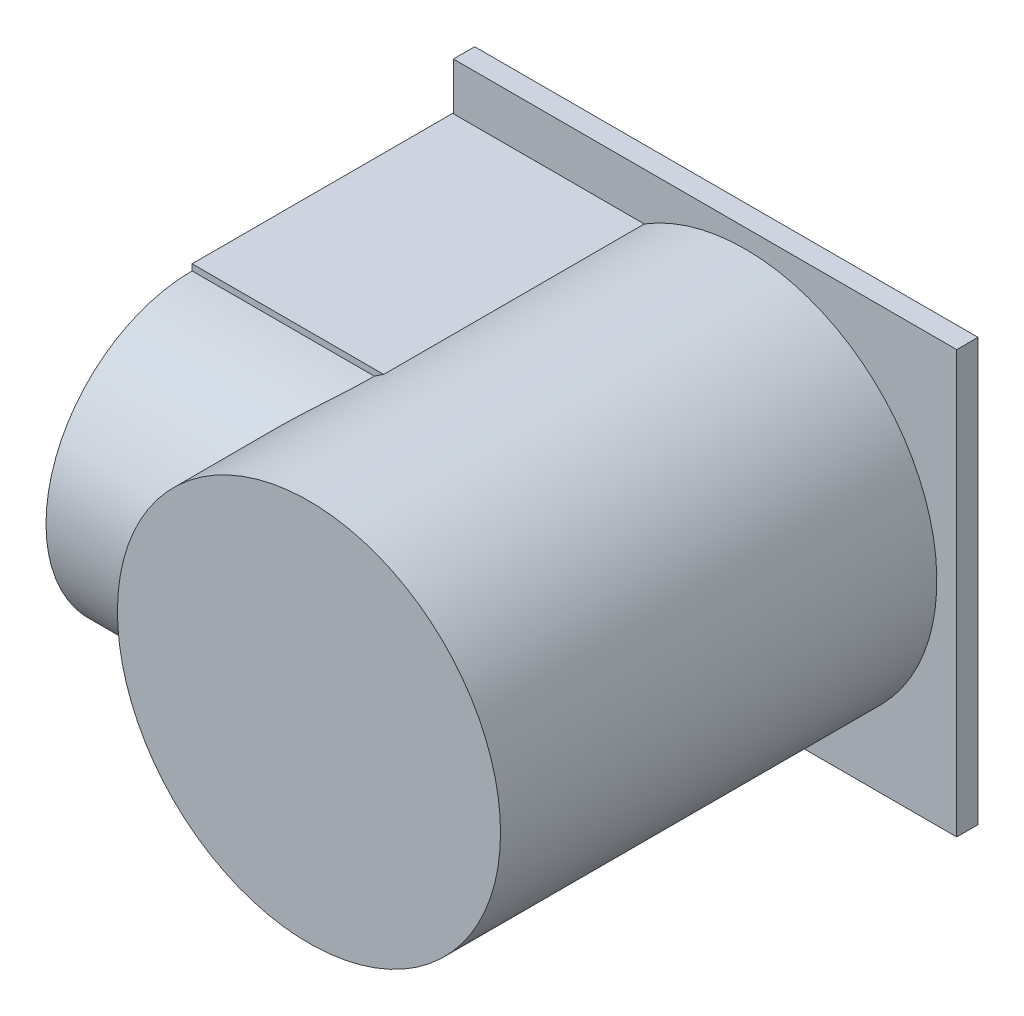
ISO-10303-21;
HEADER;
FILE_DESCRIPTION(('STEP AP214'),'2;1');
FILE_NAME('part.step','',(''),(''),'','','');
FILE_SCHEMA(('AUTOMOTIVE_DESIGN { 1 0 10303 214 1 1 1 1 }'));
ENDSEC;
DATA;
#1=APPLICATION_CONTEXT('core data for automotive mechanical design processes');
#2=APPLICATION_PROTOCOL_DEFINITION('international standard','automotive_design',2000,#1);
#3=PRODUCT_CONTEXT('',#1,'mechanical');
#4=PRODUCT('Part','Part','',(#3));
#5=PRODUCT_RELATED_PRODUCT_CATEGORY('part','',(#4));
#6=PRODUCT_DEFINITION_FORMATION('','',#4);
#7=PRODUCT_DEFINITION_CONTEXT('part definition',#1,'design');
#8=PRODUCT_DEFINITION('design','',#6,#7);
#9=PRODUCT_DEFINITION_SHAPE('','',#8);
#10=(LENGTH_UNIT() NAMED_UNIT(*) SI_UNIT(.MILLI.,.METRE.));
#11=(NAMED_UNIT(*) PLANE_ANGLE_UNIT() SI_UNIT($,.RADIAN.));
#12=(NAMED_UNIT(*) SI_UNIT($,.STERADIAN.) SOLID_ANGLE_UNIT());
#13=UNCERTAINTY_MEASURE_WITH_UNIT(LENGTH_MEASURE(1.E-05),#10,'distance_accuracy_value','');
#14=(GEOMETRIC_REPRESENTATION_CONTEXT(3) GLOBAL_UNCERTAINTY_ASSIGNED_CONTEXT((#13)) GLOBAL_UNIT_ASSIGNED_CONTEXT((#10,
#11,#12)) REPRESENTATION_CONTEXT('',''));
#15=CARTESIAN_POINT('',(0.,0.,0.));
#16=DIRECTION('',(0.,0.,1.));
#17=DIRECTION('',(1.,0.,0.));
#18=AXIS2_PLACEMENT_3D('',#15,#16,#17);
#19=CARTESIAN_POINT('',(-0.0548649234869392,0.0395000018179417,0.004));
#20=DIRECTION('',(1.,0.,0.));
#21=DIRECTION('',(0.,0.,-1.));
#22=AXIS2_PLACEMENT_3D('',#19,#20,#21);
#23=PLANE('',#22);
#24=DIRECTION('',(0.,-1.,0.));
#25=VECTOR('',#24,1.);
#26=CARTESIAN_POINT('',(-0.0548649234869392,0.0395000018179417,0.004));
#27=LINE('',#26,#25);
#28=CARTESIAN_POINT('',(-0.0548649234869392,-0.0266377465898415,0.004));
#29=VERTEX_POINT('',#28);
#30=CARTESIAN_POINT('',(-0.0548649234869392,-0.0398287939257645,0.004));
#31=VERTEX_POINT('',#30);
#32=EDGE_CURVE('E203',#29,#31,#27,.T.);
#33=ORIENTED_EDGE('',*,*,#32,.F.);
#34=DIRECTION('',(0.,0.,-1.));
#35=VECTOR('',#34,1.);
#36=CARTESIAN_POINT('',(-0.0548649234869392,-0.0266377465898415,0.004));
#37=LINE('',#36,#35);
#38=CARTESIAN_POINT('',(-0.0548649234869392,-0.0266377465898415,0.));
#39=VERTEX_POINT('',#38);
#40=EDGE_CURVE('E190',#29,#39,#37,.T.);
#41=ORIENTED_EDGE('',*,*,#40,.T.);
#42=DIRECTION('',(0.,-1.,0.));
#43=VECTOR('',#42,1.);
#44=CARTESIAN_POINT('',(-0.0548649234869392,0.0395000018179417,0.));
#45=LINE('',#44,#43);
#46=CARTESIAN_POINT('',(-0.0548649234869392,-0.0398287939257645,0.));
#47=VERTEX_POINT('',#46);
#48=EDGE_CURVE('E213',#39,#47,#45,.T.);
#49=ORIENTED_EDGE('',*,*,#48,.T.);
#50=DIRECTION('',(0.,0.,-1.));
#51=VECTOR('',#50,1.);
#52=CARTESIAN_POINT('',(-0.0548649234869392,-0.0398287939257645,0.004));
#53=LINE('',#52,#51);
#54=EDGE_CURVE('E218',#31,#47,#53,.T.);
#55=ORIENTED_EDGE('',*,*,#54,.F.);
#56=EDGE_LOOP('',(#33,#41,#49,#55));
#57=FACE_BOUND('',#56,.T.);
#58=ADVANCED_FACE('F39',(#57),#23,.F.);
#59=CARTESIAN_POINT('',(0.,0.,0.004));
#60=DIRECTION('',(0.,0.,-1.));
#61=DIRECTION('',(-1.,0.,0.));
#62=AXIS2_PLACEMENT_3D('',#59,#60,#61);
#63=PLANE('',#62);
#64=CARTESIAN_POINT('',(0.,0.,0.004));
#65=DIRECTION('',(0.,0.,1.));
#66=DIRECTION('',(1.,0.,0.));
#67=AXIS2_PLACEMENT_3D('',#64,#65,#66);
#68=CIRCLE('',#67,0.0360000007123364);
#69=CARTESIAN_POINT('',(-0.0242163273000595,-0.0266377465898415,0.004));
#70=VERTEX_POINT('',#69);
#71=CARTESIAN_POINT('',(-0.0189810072070969,0.030589563852601,0.004));
#72=VERTEX_POINT('',#71);
#73=EDGE_CURVE('E196',#70,#72,#68,.T.);
#74=ORIENTED_EDGE('',*,*,#73,.F.);
#75=DIRECTION('',(-1.,0.,0.));
#76=VECTOR('',#75,1.);
#77=CARTESIAN_POINT('',(0.,-0.0266377465898415,0.004));
#78=LINE('',#77,#76);
#79=EDGE_CURVE('E187',#70,#29,#78,.T.);
#80=ORIENTED_EDGE('',*,*,#79,.T.);
#81=ORIENTED_EDGE('',*,*,#32,.T.);
#82=DIRECTION('',(1.,0.,0.));
#83=VECTOR('',#82,1.);
#84=CARTESIAN_POINT('',(0.0397354840885006,-0.0398287939257645,0.004));
#85=LINE('',#84,#83);
#86=CARTESIAN_POINT('',(0.0397354840885006,-0.0398287939257645,0.004));
#87=VERTEX_POINT('',#86);
#88=EDGE_CURVE('E63',#31,#87,#85,.T.);
#89=ORIENTED_EDGE('',*,*,#88,.T.);
#90=DIRECTION('',(0.,1.,0.));
#91=VECTOR('',#90,1.);
#92=CARTESIAN_POINT('',(0.0397354840885006,0.0395000018179417,0.004));
#93=LINE('',#92,#91);
#94=CARTESIAN_POINT('',(0.0397354840885006,0.0395000018179417,0.004));
#95=VERTEX_POINT('',#94);
#96=EDGE_CURVE('E200',#87,#95,#93,.T.);
#97=ORIENTED_EDGE('',*,*,#96,.T.);
#98=DIRECTION('',(-1.,0.,0.));
#99=VECTOR('',#98,1.);
#100=CARTESIAN_POINT('',(0.0397354840885006,0.0395000018179417,0.004));
#101=LINE('',#100,#99);
#102=CARTESIAN_POINT('',(-0.0548649234869392,0.0395000018179417,0.004));
#103=VERTEX_POINT('',#102);
#104=EDGE_CURVE('E92',#95,#103,#101,.T.);
#105=ORIENTED_EDGE('',*,*,#104,.T.);
#106=CARTESIAN_POINT('',(-0.0548649234869392,0.030589563852601,0.004));
#107=VERTEX_POINT('',#106);
#108=EDGE_CURVE('E204',#103,#107,#27,.T.);
#109=ORIENTED_EDGE('',*,*,#108,.T.);
#110=DIRECTION('',(1.,0.,0.));
#111=VECTOR('',#110,1.);
#112=CARTESIAN_POINT('',(0.,0.030589563852601,0.004));
#113=LINE('',#112,#111);
#114=EDGE_CURVE('E173',#107,#72,#113,.T.);
#115=ORIENTED_EDGE('',*,*,#114,.T.);
#116=EDGE_LOOP('',(#74,#80,#81,#89,#97,#105,#109,#115));
#117=FACE_BOUND('',#116,.T.);
#118=ADVANCED_FACE('F268',(#117),#63,.F.);
#119=CARTESIAN_POINT('',(0.,0.,0.));
#120=DIRECTION('',(0.,0.,-1.));
#121=DIRECTION('',(-1.,0.,0.));
#122=AXIS2_PLACEMENT_3D('',#119,#120,#121);
#123=PLANE('',#122);
#124=ORIENTED_EDGE('',*,*,#48,.F.);
#125=DIRECTION('',(1.,0.,0.));
#126=VECTOR('',#125,1.);
#127=CARTESIAN_POINT('',(-0.055,-0.0266377465898415,0.));
#128=LINE('',#127,#126);
#129=CARTESIAN_POINT('',(-0.055,-0.0266377465898415,0.));
#130=VERTEX_POINT('',#129);
#131=EDGE_CURVE('E161',#130,#39,#128,.T.);
#132=ORIENTED_EDGE('',*,*,#131,.F.);
#133=DIRECTION('',(0.,1.,0.));
#134=VECTOR('',#133,1.);
#135=CARTESIAN_POINT('',(-0.055,0.030589563852601,0.));
#136=LINE('',#135,#134);
#137=CARTESIAN_POINT('',(-0.055,0.030589563852601,0.));
#138=VERTEX_POINT('',#137);
#139=EDGE_CURVE('E153',#130,#138,#136,.T.);
#140=ORIENTED_EDGE('',*,*,#139,.T.);
#141=DIRECTION('',(1.,0.,0.));
#142=VECTOR('',#141,1.);
#143=CARTESIAN_POINT('',(-0.055,0.030589563852601,0.));
#144=LINE('',#143,#142);
#145=CARTESIAN_POINT('',(-0.0548649234869392,0.030589563852601,0.));
#146=VERTEX_POINT('',#145);
#147=EDGE_CURVE('E136',#138,#146,#144,.T.);
#148=ORIENTED_EDGE('',*,*,#147,.T.);
#149=CARTESIAN_POINT('',(-0.0548649234869392,0.0395000018179417,0.));
#150=VERTEX_POINT('',#149);
#151=EDGE_CURVE('E214',#150,#146,#45,.T.);
#152=ORIENTED_EDGE('',*,*,#151,.F.);
#153=DIRECTION('',(-1.,0.,0.));
#154=VECTOR('',#153,1.);
#155=CARTESIAN_POINT('',(0.0397354840885006,0.0395000018179417,0.));
#156=LINE('',#155,#154);
#157=CARTESIAN_POINT('',(0.0397354840885006,0.0395000018179417,0.));
#158=VERTEX_POINT('',#157);
#159=EDGE_CURVE('E211',#158,#150,#156,.T.);
#160=ORIENTED_EDGE('',*,*,#159,.F.);
#161=DIRECTION('',(0.,1.,0.));
#162=VECTOR('',#161,1.);
#163=CARTESIAN_POINT('',(0.0397354840885006,0.0395000018179417,0.));
#164=LINE('',#163,#162);
#165=CARTESIAN_POINT('',(0.0397354840885006,-0.0398287939257645,0.));
#166=VERTEX_POINT('',#165);
#167=EDGE_CURVE('E199',#166,#158,#164,.T.);
#168=ORIENTED_EDGE('',*,*,#167,.F.);
#169=DIRECTION('',(1.,0.,0.));
#170=VECTOR('',#169,1.);
#171=CARTESIAN_POINT('',(0.0397354840885006,-0.0398287939257645,0.));
#172=LINE('',#171,#170);
#173=EDGE_CURVE('E84',#47,#166,#172,.T.);
#174=ORIENTED_EDGE('',*,*,#173,.F.);
#175=EDGE_LOOP('',(#124,#132,#140,#148,#152,#160,#168,#174));
#176=FACE_BOUND('',#175,.T.);
#177=ADVANCED_FACE('F160',(#176),#123,.T.);
#178=CARTESIAN_POINT('',(0.0397354840885006,0.0395000018179417,0.004));
#179=DIRECTION('',(-1.,0.,0.));
#180=DIRECTION('',(0.,0.,1.));
#181=AXIS2_PLACEMENT_3D('',#178,#179,#180);
#182=PLANE('',#181);
#183=ORIENTED_EDGE('',*,*,#167,.T.);
#184=DIRECTION('',(0.,0.,-1.));
#185=VECTOR('',#184,1.);
#186=CARTESIAN_POINT('',(0.0397354840885006,0.0395000018179417,0.004));
#187=LINE('',#186,#185);
#188=EDGE_CURVE('E223',#95,#158,#187,.T.);
#189=ORIENTED_EDGE('',*,*,#188,.F.);
#190=ORIENTED_EDGE('',*,*,#96,.F.);
#191=DIRECTION('',(0.,0.,-1.));
#192=VECTOR('',#191,1.);
#193=CARTESIAN_POINT('',(0.0397354840885006,-0.0398287939257645,0.004));
#194=LINE('',#193,#192);
#195=EDGE_CURVE('E208',#87,#166,#194,.T.);
#196=ORIENTED_EDGE('',*,*,#195,.T.);
#197=EDGE_LOOP('',(#183,#189,#190,#196));
#198=FACE_BOUND('',#197,.T.);
#199=ADVANCED_FACE('F41',(#198),#182,.F.);
#200=CARTESIAN_POINT('',(0.0397354840885006,0.0395000018179417,0.004));
#201=DIRECTION('',(0.,-1.,0.));
#202=DIRECTION('',(0.,0.,-1.));
#203=AXIS2_PLACEMENT_3D('',#200,#201,#202);
#204=PLANE('',#203);
#205=ORIENTED_EDGE('',*,*,#159,.T.);
#206=DIRECTION('',(0.,0.,-1.));
#207=VECTOR('',#206,1.);
#208=CARTESIAN_POINT('',(-0.0548649234869392,0.0395000018179417,0.004));
#209=LINE('',#208,#207);
#210=EDGE_CURVE('E220',#103,#150,#209,.T.);
#211=ORIENTED_EDGE('',*,*,#210,.F.);
#212=ORIENTED_EDGE('',*,*,#104,.F.);
#213=ORIENTED_EDGE('',*,*,#188,.T.);
#214=EDGE_LOOP('',(#205,#211,#212,#213));
#215=FACE_BOUND('',#214,.T.);
#216=ADVANCED_FACE('F278',(#215),#204,.F.);
#217=ORIENTED_EDGE('',*,*,#151,.T.);
#218=DIRECTION('',(0.,0.,1.));
#219=VECTOR('',#218,1.);
#220=CARTESIAN_POINT('',(-0.0548649234869392,0.030589563852601,0.004));
#221=LINE('',#220,#219);
#222=EDGE_CURVE('E141',#146,#107,#221,.T.);
#223=ORIENTED_EDGE('',*,*,#222,.T.);
#224=ORIENTED_EDGE('',*,*,#108,.F.);
#225=ORIENTED_EDGE('',*,*,#210,.T.);
#226=EDGE_LOOP('',(#217,#223,#224,#225));
#227=FACE_BOUND('',#226,.T.);
#228=ADVANCED_FACE('F271',(#227),#23,.F.);
#229=CARTESIAN_POINT('',(0.0397354840885006,-0.0398287939257645,0.004));
#230=DIRECTION('',(0.,1.,0.));
#231=DIRECTION('',(0.,0.,1.));
#232=AXIS2_PLACEMENT_3D('',#229,#230,#231);
#233=PLANE('',#232);
#234=ORIENTED_EDGE('',*,*,#173,.T.);
#235=ORIENTED_EDGE('',*,*,#195,.F.);
#236=ORIENTED_EDGE('',*,*,#88,.F.);
#237=ORIENTED_EDGE('',*,*,#54,.T.);
#238=EDGE_LOOP('',(#234,#235,#236,#237));
#239=FACE_BOUND('',#238,.T.);
#240=ADVANCED_FACE('F266',(#239),#233,.F.);
#241=CARTESIAN_POINT('',(0.,0.,0.086));
#242=DIRECTION('',(0.,0.,-1.));
#243=DIRECTION('',(-1.,0.,0.));
#244=AXIS2_PLACEMENT_3D('',#241,#242,#243);
#245=CYLINDRICAL_SURFACE('',#244,0.0360000007123364);
#246=CARTESIAN_POINT('',(0.,0.,0.086));
#247=DIRECTION('',(0.,0.,1.));
#248=DIRECTION('',(1.,0.,0.));
#249=AXIS2_PLACEMENT_3D('',#246,#247,#248);
#250=CIRCLE('',#249,0.0360000007123364);
#251=CARTESIAN_POINT('',(0.0360000007123364,0.,0.086));
#252=VERTEX_POINT('',#251);
#253=EDGE_CURVE('E193',#252,#252,#250,.T.);
#254=ORIENTED_EDGE('',*,*,#253,.F.);
#255=EDGE_LOOP('',(#254));
#256=FACE_BOUND('',#255,.T.);
#257=CARTESIAN_POINT('',(0.,0.,0.052977393472986));
#258=DIRECTION('',(0.,0.,1.));
#259=DIRECTION('',(1.,0.,0.));
#260=AXIS2_PLACEMENT_3D('',#257,#258,#259);
#261=CIRCLE('',#260,0.0360000007123364);
#262=CARTESIAN_POINT('',(-0.0254366793809331,-0.0254749954535782,0.052977393472986));
#263=VERTEX_POINT('',#262);
#264=CARTESIAN_POINT('',(-0.0242163273000595,-0.0266377465898415,0.052977393472986));
#265=VERTEX_POINT('',#264);
#266=EDGE_CURVE('E47',#263,#265,#261,.T.);
#267=ORIENTED_EDGE('',*,*,#266,.T.);
#268=DIRECTION('',(0.,0.,-1.));
#269=VECTOR('',#268,1.);
#270=CARTESIAN_POINT('',(-0.0242163273000595,-0.0266377465898415,0.086));
#271=LINE('',#270,#269);
#272=EDGE_CURVE('E11',#265,#70,#271,.T.);
#273=ORIENTED_EDGE('',*,*,#272,.T.);
#274=ORIENTED_EDGE('',*,*,#73,.T.);
#275=DIRECTION('',(0.,0.,-1.));
#276=VECTOR('',#275,1.);
#277=CARTESIAN_POINT('',(-0.0189810072070969,0.030589563852601,0.086));
#278=LINE('',#277,#276);
#279=CARTESIAN_POINT('',(-0.0189810072070969,0.030589563852601,0.052977393472986));
#280=VERTEX_POINT('',#279);
#281=EDGE_CURVE('E225',#72,#280,#278,.F.);
#282=ORIENTED_EDGE('',*,*,#281,.T.);
#283=CARTESIAN_POINT('',(0.,0.,0.052977393472986));
#284=DIRECTION('',(0.,0.,1.));
#285=DIRECTION('',(1.,0.,0.));
#286=AXIS2_PLACEMENT_3D('',#283,#284,#285);
#287=CIRCLE('',#286,0.0360000007123364);
#288=CARTESIAN_POINT('',(-0.0207379542058951,0.0294268127163377,0.052977393472986));
#289=VERTEX_POINT('',#288);
#290=EDGE_CURVE('E228',#280,#289,#287,.T.);
#291=ORIENTED_EDGE('',*,*,#290,.T.);
#292=CARTESIAN_POINT('',(-0.0360000007123364,0.,0.0803570925246922));
#293=CARTESIAN_POINT('',(-0.0359998972550926,-0.00135258764130345,0.0802593710135294));
#294=CARTESIAN_POINT('',(-0.0359230240059765,-0.00269906551596122,0.0800608011389155));
#295=CARTESIAN_POINT('',(-0.0356274511411182,-0.00533397492721779,0.0794717027138689));
#296=CARTESIAN_POINT('',(-0.035408516580344,-0.00662230651793142,0.0790808564306815));
#297=CARTESIAN_POINT('',(-0.0348543990679192,-0.00909783790750347,0.0781303693460599));
#298=CARTESIAN_POINT('',(-0.034519946963392,-0.0102856164103511,0.0775717925633743));
#299=CARTESIAN_POINT('',(-0.0337634797021239,-0.0125479958174366,0.0763074068116953));
#300=CARTESIAN_POINT('',(-0.0333414790038112,-0.0136226153654666,0.0756016221536062));
#301=CARTESIAN_POINT('',(-0.0323937484868921,-0.0157524231441818,0.0739828166950234));
#302=CARTESIAN_POINT('',(-0.0318618164158923,-0.0167942781363357,0.0730559559980125));
#303=CARTESIAN_POINT('',(-0.0307691369375067,-0.0187214071478258,0.0710632750579345));
#304=CARTESIAN_POINT('',(-0.0302083332798352,-0.019606359332978,0.0699971768143247));
#305=CARTESIAN_POINT('',(-0.0290057578211644,-0.0213536231360055,0.0675361075256862));
#306=CARTESIAN_POINT('',(-0.0283673801416106,-0.0221837580043265,0.0661163916612304));
#307=CARTESIAN_POINT('',(-0.0272100115278611,-0.0235890919341026,0.0631121169584234));
#308=CARTESIAN_POINT('',(-0.0266906693348595,-0.0241650458312615,0.0615280636923625));
#309=CARTESIAN_POINT('',(-0.0260278836129564,-0.0248736487097298,0.0587991256084679));
#310=CARTESIAN_POINT('',(-0.0258165303068815,-0.0250907926911911,0.0576928614601002));
#311=CARTESIAN_POINT('',(-0.0255252435044456,-0.0253871483085114,0.0554459336684245));
#312=CARTESIAN_POINT('',(-0.0254450669178515,-0.025466615097109,0.054305337652812));
#313=CARTESIAN_POINT('',(-0.025429542523465,-0.0254821269915332,0.0520197579238784));
#314=CARTESIAN_POINT('',(-0.0254944966124536,-0.0254178731333823,0.0508747700195788));
#315=CARTESIAN_POINT('',(-0.0257584228426044,-0.0251502839984772,0.0486161986910486));
#316=CARTESIAN_POINT('',(-0.0259576140045172,-0.0249467214176619,0.0475026696936213));
#317=CARTESIAN_POINT('',(-0.0265299984570788,-0.0243387723799677,0.0450322440604181));
#318=CARTESIAN_POINT('',(-0.0269360413036838,-0.0238944671129634,0.043692993761994));
#319=CARTESIAN_POINT('',(-0.0278486166258294,-0.0228242814982514,0.0411264597272722));
#320=CARTESIAN_POINT('',(-0.028355306567728,-0.0221981159043091,0.0398993558975633));
#321=CARTESIAN_POINT('',(-0.0294234378750543,-0.0207625339947527,0.0375347347446587));
#322=CARTESIAN_POINT('',(-0.0299859486859535,-0.0199488374891784,0.0364003143608235));
#323=CARTESIAN_POINT('',(-0.0311036737905038,-0.0181570446194754,0.0342648358025976));
#324=CARTESIAN_POINT('',(-0.0316588844230461,-0.0171788689218551,0.0332638424039286));
#325=CARTESIAN_POINT('',(-0.0328169846705364,-0.014866588401322,0.0312364658260604));
#326=CARTESIAN_POINT('',(-0.0334093606056713,-0.0135001315631353,0.0302403701025941));
#327=CARTESIAN_POINT('',(-0.0344493530625488,-0.0105663440412652,0.0285001830365824));
#328=CARTESIAN_POINT('',(-0.0348972679974002,-0.00899943690757818,0.0277555720497565));
#329=CARTESIAN_POINT('',(-0.0354845092838676,-0.00618724425392983,0.0267387757001615));
#330=CARTESIAN_POINT('',(-0.0356755649868158,-0.00497938577963109,0.0263922861579271));
#331=CARTESIAN_POINT('',(-0.0359333318353882,-0.00251501939730506,0.0258671328412863));
#332=CARTESIAN_POINT('',(-0.0360001464026271,-0.00125855284223328,0.0256883295419238));
#333=CARTESIAN_POINT('',(-0.0359998543228675,0.00126938077897288,0.0255062788249917));
#334=CARTESIAN_POINT('',(-0.035932505091639,0.00254087087722455,0.0255033497072409));
#335=CARTESIAN_POINT('',(-0.0356653602975148,0.00505819995181243,0.025670910749366));
#336=CARTESIAN_POINT('',(-0.0354655302355937,0.00630403215948417,0.0258414460868997));
#337=CARTESIAN_POINT('',(-0.0349508123444302,0.0087139356959293,0.0263383530764));
#338=CARTESIAN_POINT('',(-0.0346380970460837,0.00987908604760175,0.0266618157434807));
#339=CARTESIAN_POINT('',(-0.0339155330080905,0.01213000330375,0.027445662043073));
#340=CARTESIAN_POINT('',(-0.0335056406703687,0.0132157342901321,0.0279061071558889));
#341=CARTESIAN_POINT('',(-0.0324391463337123,0.0156887263691853,0.029142973306379));
#342=CARTESIAN_POINT('',(-0.0317479202238166,0.0170342996213976,0.0299730096456754));
#343=CARTESIAN_POINT('',(-0.0302737122206422,0.0195350501492521,0.0318195179660319));
#344=CARTESIAN_POINT('',(-0.029490541661686,0.0206898238062345,0.0328363757977924));
#345=CARTESIAN_POINT('',(-0.0278760874743442,0.0228196051934423,0.0350473659960473));
#346=CARTESIAN_POINT('',(-0.0270442573109477,0.0237916474307175,0.0362439349681786));
#347=CARTESIAN_POINT('',(-0.0254091401524777,0.0255301674288669,0.0387952914891964));
#348=CARTESIAN_POINT('',(-0.0246058229291082,0.0262968688958919,0.0401499045291029));
#349=CARTESIAN_POINT('',(-0.0233746229500078,0.0273872432131796,0.0425413157673531));
#350=CARTESIAN_POINT('',(-0.02291142279734,0.0277731555750338,0.043531475651138));
#351=CARTESIAN_POINT('',(-0.0220842835760377,0.0284352657809063,0.0455871630470957));
#352=CARTESIAN_POINT('',(-0.0217201424086131,0.0287116875400267,0.0466525314374579));
#353=CARTESIAN_POINT('',(-0.021199813674281,0.0290973191129034,0.0486412380388372));
#354=CARTESIAN_POINT('',(-0.0210172949525708,0.0292282895264133,0.0495532320217721));
#355=CARTESIAN_POINT('',(-0.0207804527850833,0.0293972045501671,0.0514017935393281));
#356=CARTESIAN_POINT('',(-0.0207259360438503,0.0294352894299867,0.0523383218591703));
#357=CARTESIAN_POINT('',(-0.0207545126184037,0.0294151360837959,0.0542092165133414));
#358=CARTESIAN_POINT('',(-0.0208377672308839,0.0293567849548146,0.0551435790292315));
#359=CARTESIAN_POINT('',(-0.0211275862053552,0.029148850408067,0.0569828756924524));
#360=CARTESIAN_POINT('',(-0.0213343566632332,0.028999114498546,0.0578877579825204));
#361=CARTESIAN_POINT('',(-0.0219526120928546,0.0285357033896793,0.0600346892218115));
#362=CARTESIAN_POINT('',(-0.0224139905268619,0.0281790905062811,0.0612527379946849));
#363=CARTESIAN_POINT('',(-0.0234489563729554,0.0273239758587552,0.0635879516056435));
#364=CARTESIAN_POINT('',(-0.0240229245383632,0.0268249899429625,0.064704754774429));
#365=CARTESIAN_POINT('',(-0.0254897304206157,0.0254495458328095,0.0673155796702701));
#366=CARTESIAN_POINT('',(-0.0264110741152892,0.024503831365883,0.0687571746287497));
#367=CARTESIAN_POINT('',(-0.0282483605555856,0.0223613636248725,0.071441598445068));
#368=CARTESIAN_POINT('',(-0.0291643057354991,0.0211647340934835,0.0726845247489676));
#369=CARTESIAN_POINT('',(-0.0307571241260469,0.0187539053298514,0.0747514593927255));
#370=CARTESIAN_POINT('',(-0.0314478238253189,0.0175792140538824,0.0756107213510783));
#371=CARTESIAN_POINT('',(-0.0327254327300142,0.0150672768747635,0.0771503073219934));
#372=CARTESIAN_POINT('',(-0.0333124938548274,0.0137302738356477,0.0778308939726325));
#373=CARTESIAN_POINT('',(-0.0342485619068361,0.0111609257602525,0.0788764423306494));
#374=CARTESIAN_POINT('',(-0.034621254232983,0.00995126342664188,0.0792758065273148));
#375=CARTESIAN_POINT('',(-0.0352420960322068,0.00745886364681594,0.0799056886008065));
#376=CARTESIAN_POINT('',(-0.0354904653651826,0.00617625970162543,0.0801365048815857));
#377=CARTESIAN_POINT('',(-0.0357783788685725,0.00407065479020896,0.0803602545029025));
#378=CARTESIAN_POINT('',(-0.0358614476347164,0.00325915107101149,0.0804103659922546));
#379=CARTESIAN_POINT('',(-0.0359722934864198,0.00163102702108362,0.0804382094854766));
#380=CARTESIAN_POINT('',(-0.0360000630049362,0.000814406005447038,0.0804159315848183));
#381=CARTESIAN_POINT('',(-0.0360000007123364,0.,0.0803570925246922));
#382=B_SPLINE_CURVE_WITH_KNOTS('',3,(#292,#293,#294,#295,#296,#297,#298,#299,#300,#301,#302,
#303,#304,#305,#306,#307,#308,#309,#310,#311,#312,#313,#314,#315,#316,#317,#318,#319,#320,#321,
#322,#323,#324,#325,#326,#327,#328,#329,#330,#331,#332,#333,#334,#335,#336,#337,#338,#339,#340,
#341,#342,#343,#344,#345,#346,#347,#348,#349,#350,#351,#352,#353,#354,#355,#356,#357,#358,#359,
#360,#361,#362,#363,#364,#365,#366,#367,#368,#369,#370,#371,#372,#373,#374,#375,#376,#377,#378,
#379,#380,#381),.UNSPECIFIED.,.T.,.F.,(4,2,2,2,2,2,2,2,2,2,2,2,2,2,2,2,2,2,2,2,2,2,2,2,2,2,2,2,
2,2,2,2,2,2,2,2,2,2,2,2,2,2,2,2,4),(0.,0.00406484159665236,0.00813642293719961,
0.012182702590785,0.0162283145427312,0.0206894667362631,0.0251596662309594,0.0304269884510147,
0.035678561395965,0.0391056304647641,0.0425263414348429,0.0459541746956014,0.0493876143818197,
0.0537686059315693,0.0581565064822055,0.0626567179982212,0.0671591063671351,0.0725038490268865,
0.077837479265015,0.0816342115438674,0.085427781904843,0.0892282177216785,0.0930296435901117,
0.0967615017291521,0.100495037329853,0.10564367074263,0.110803059899856,0.116040060743948,
0.121271332772775,0.124740546545026,0.128202628468572,0.131008628648732,0.133810388762441,
0.136615431375964,0.139425167548515,0.14345364252808,0.147495983375804,0.153331475801028,
0.159164097101951,0.163978867350969,0.168786520145738,0.172752144133656,0.176710730086842,
0.179157875400329,0.181605355553493),.UNSPECIFIED.);
#383=EDGE_CURVE('E231',#289,#263,#382,.T.);
#384=ORIENTED_EDGE('',*,*,#383,.T.);
#385=EDGE_LOOP('',(#267,#273,#274,#282,#291,#384));
#386=FACE_BOUND('',#385,.T.);
#387=ADVANCED_FACE('F238',(#256,#386),#245,.T.);
#388=CARTESIAN_POINT('',(0.,0.,0.086));
#389=DIRECTION('',(0.,0.,1.));
#390=DIRECTION('',(1.,0.,0.));
#391=AXIS2_PLACEMENT_3D('',#388,#389,#390);
#392=PLANE('',#391);
#393=ORIENTED_EDGE('',*,*,#253,.T.);
#394=EDGE_LOOP('',(#393));
#395=FACE_BOUND('',#394,.T.);
#396=ADVANCED_FACE('F256',(#395),#392,.T.);
#397=CARTESIAN_POINT('',(-0.055,-0.0266377465898415,0.));
#398=DIRECTION('',(0.,-1.,0.));
#399=DIRECTION('',(0.,0.,-1.));
#400=AXIS2_PLACEMENT_3D('',#397,#398,#399);
#401=PLANE('',#400);
#402=ORIENTED_EDGE('',*,*,#40,.F.);
#403=ORIENTED_EDGE('',*,*,#79,.F.);
#404=ORIENTED_EDGE('',*,*,#272,.F.);
#405=DIRECTION('',(1.,0.,0.));
#406=VECTOR('',#405,1.);
#407=CARTESIAN_POINT('',(-0.055,-0.0266377465898415,0.052977393472986));
#408=LINE('',#407,#406);
#409=CARTESIAN_POINT('',(-0.055,-0.0266377465898415,0.052977393472986));
#410=VERTEX_POINT('',#409);
#411=EDGE_CURVE('E174',#410,#265,#408,.T.);
#412=ORIENTED_EDGE('',*,*,#411,.F.);
#413=DIRECTION('',(0.,0.,-1.));
#414=VECTOR('',#413,1.);
#415=CARTESIAN_POINT('',(-0.055,-0.0266377465898415,0.));
#416=LINE('',#415,#414);
#417=EDGE_CURVE('E146',#410,#130,#416,.T.);
#418=ORIENTED_EDGE('',*,*,#417,.T.);
#419=ORIENTED_EDGE('',*,*,#131,.T.);
#420=EDGE_LOOP('',(#402,#403,#404,#412,#418,#419));
#421=FACE_BOUND('',#420,.T.);
#422=ADVANCED_FACE('F247',(#421),#401,.T.);
#423=CARTESIAN_POINT('',(-0.055,0.00197590863137975,0.052977393472986));
#424=DIRECTION('',(1.,0.,0.));
#425=DIRECTION('',(0.,0.,-1.));
#426=AXIS2_PLACEMENT_3D('',#423,#424,#425);
#427=CYLINDRICAL_SURFACE('',#426,0.027450904084958);
#428=ORIENTED_EDGE('',*,*,#383,.F.);
#429=DIRECTION('',(1.,0.,0.));
#430=VECTOR('',#429,1.);
#431=CARTESIAN_POINT('',(-0.055,0.0294268127163377,0.052977393472986));
#432=LINE('',#431,#430);
#433=CARTESIAN_POINT('',(-0.055,0.0294268127163377,0.052977393472986));
#434=VERTEX_POINT('',#433);
#435=EDGE_CURVE('E180',#434,#289,#432,.T.);
#436=ORIENTED_EDGE('',*,*,#435,.F.);
#437=CARTESIAN_POINT('',(-0.055,0.00197590863137975,0.052977393472986));
#438=DIRECTION('',(1.,0.,0.));
#439=DIRECTION('',(0.,0.,-1.));
#440=AXIS2_PLACEMENT_3D('',#437,#438,#439);
#441=CIRCLE('',#440,0.027450904084958);
#442=CARTESIAN_POINT('',(-0.055,-0.0254749954535782,0.052977393472986));
#443=VERTEX_POINT('',#442);
#444=EDGE_CURVE('E165',#434,#443,#441,.T.);
#445=ORIENTED_EDGE('',*,*,#444,.T.);
#446=DIRECTION('',(1.,0.,0.));
#447=VECTOR('',#446,1.);
#448=CARTESIAN_POINT('',(-0.055,-0.0254749954535782,0.052977393472986));
#449=LINE('',#448,#447);
#450=EDGE_CURVE('E177',#443,#263,#449,.T.);
#451=ORIENTED_EDGE('',*,*,#450,.T.);
#452=EDGE_LOOP('',(#428,#436,#445,#451));
#453=FACE_BOUND('',#452,.T.);
#454=ADVANCED_FACE('F242',(#453),#427,.T.);
#455=CARTESIAN_POINT('',(-0.055,0.030589563852601,0.));
#456=DIRECTION('',(0.,1.,0.));
#457=DIRECTION('',(0.,0.,1.));
#458=AXIS2_PLACEMENT_3D('',#455,#456,#457);
#459=PLANE('',#458);
#460=ORIENTED_EDGE('',*,*,#222,.F.);
#461=ORIENTED_EDGE('',*,*,#147,.F.);
#462=DIRECTION('',(0.,0.,1.));
#463=VECTOR('',#462,1.);
#464=CARTESIAN_POINT('',(-0.055,0.030589563852601,0.));
#465=LINE('',#464,#463);
#466=CARTESIAN_POINT('',(-0.055,0.030589563852601,0.052977393472986));
#467=VERTEX_POINT('',#466);
#468=EDGE_CURVE('E139',#138,#467,#465,.T.);
#469=ORIENTED_EDGE('',*,*,#468,.T.);
#470=DIRECTION('',(1.,0.,0.));
#471=VECTOR('',#470,1.);
#472=CARTESIAN_POINT('',(-0.055,0.030589563852601,0.052977393472986));
#473=LINE('',#472,#471);
#474=EDGE_CURVE('E54',#467,#280,#473,.T.);
#475=ORIENTED_EDGE('',*,*,#474,.T.);
#476=ORIENTED_EDGE('',*,*,#281,.F.);
#477=ORIENTED_EDGE('',*,*,#114,.F.);
#478=EDGE_LOOP('',(#460,#461,#469,#475,#476,#477));
#479=FACE_BOUND('',#478,.T.);
#480=ADVANCED_FACE('F138',(#479),#459,.T.);
#481=CARTESIAN_POINT('',(-0.055,-0.0254749954535782,0.052977393472986));
#482=DIRECTION('',(0.,0.,1.));
#483=DIRECTION('',(1.,0.,0.));
#484=AXIS2_PLACEMENT_3D('',#481,#482,#483);
#485=PLANE('',#484);
#486=ORIENTED_EDGE('',*,*,#266,.F.);
#487=ORIENTED_EDGE('',*,*,#450,.F.);
#488=DIRECTION('',(0.,-1.,0.));
#489=VECTOR('',#488,1.);
#490=CARTESIAN_POINT('',(-0.055,-0.0254749954535782,0.052977393472986));
#491=LINE('',#490,#489);
#492=EDGE_CURVE('E168',#443,#410,#491,.T.);
#493=ORIENTED_EDGE('',*,*,#492,.T.);
#494=ORIENTED_EDGE('',*,*,#411,.T.);
#495=EDGE_LOOP('',(#486,#487,#493,#494));
#496=FACE_BOUND('',#495,.T.);
#497=ADVANCED_FACE('F249',(#496),#485,.T.);
#498=CARTESIAN_POINT('',(-0.055,0.030589563852601,0.052977393472986));
#499=DIRECTION('',(0.,0.,1.));
#500=DIRECTION('',(1.,0.,0.));
#501=AXIS2_PLACEMENT_3D('',#498,#499,#500);
#502=PLANE('',#501);
#503=ORIENTED_EDGE('',*,*,#290,.F.);
#504=ORIENTED_EDGE('',*,*,#474,.F.);
#505=DIRECTION('',(0.,-1.,0.));
#506=VECTOR('',#505,1.);
#507=CARTESIAN_POINT('',(-0.055,0.030589563852601,0.052977393472986));
#508=LINE('',#507,#506);
#509=EDGE_CURVE('E157',#467,#434,#508,.T.);
#510=ORIENTED_EDGE('',*,*,#509,.T.);
#511=ORIENTED_EDGE('',*,*,#435,.T.);
#512=EDGE_LOOP('',(#503,#504,#510,#511));
#513=FACE_BOUND('',#512,.T.);
#514=ADVANCED_FACE('F251',(#513),#502,.T.);
#515=CARTESIAN_POINT('',(-0.055,0.00197590863137975,0.052977393472986));
#516=DIRECTION('',(1.,0.,0.));
#517=DIRECTION('',(0.,0.,-1.));
#518=AXIS2_PLACEMENT_3D('',#515,#516,#517);
#519=PLANE('',#518);
#520=ORIENTED_EDGE('',*,*,#139,.F.);
#521=ORIENTED_EDGE('',*,*,#417,.F.);
#522=ORIENTED_EDGE('',*,*,#492,.F.);
#523=ORIENTED_EDGE('',*,*,#444,.F.);
#524=ORIENTED_EDGE('',*,*,#509,.F.);
#525=ORIENTED_EDGE('',*,*,#468,.F.);
#526=EDGE_LOOP('',(#520,#521,#522,#523,#524,#525));
#527=FACE_BOUND('',#526,.T.);
#528=ADVANCED_FACE('F151',(#527),#519,.F.);
#529=CLOSED_SHELL('',(#58,#118,#177,#199,#216,#228,#240,#387,#396,#422,#454,#480,#497,#514,#528));
#530=MANIFOLD_SOLID_BREP('B2',#529);
#531=ADVANCED_BREP_SHAPE_REPRESENTATION('',(#18,#530),#14);
#532=SHAPE_DEFINITION_REPRESENTATION(#9,#531);
ENDSEC;
END-ISO-10303-21;
